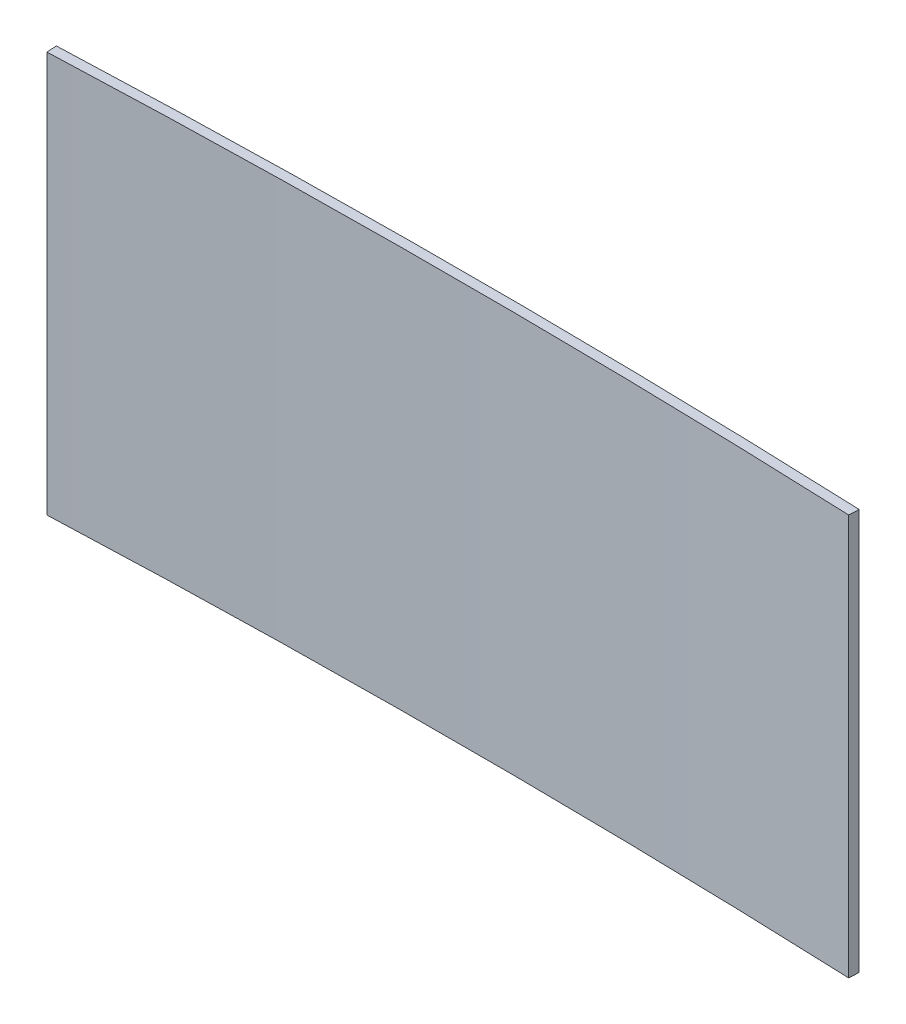
ISO-10303-21;
HEADER;
FILE_DESCRIPTION(('STEP AP214'),'2;1');
FILE_NAME('part.step','',(''),(''),'','','');
FILE_SCHEMA(('AUTOMOTIVE_DESIGN { 1 0 10303 214 1 1 1 1 }'));
ENDSEC;
DATA;
#1=APPLICATION_CONTEXT('core data for automotive mechanical design processes');
#2=APPLICATION_PROTOCOL_DEFINITION('international standard','automotive_design',2000,#1);
#3=PRODUCT_CONTEXT('',#1,'mechanical');
#4=PRODUCT('Part','Part','',(#3));
#5=PRODUCT_RELATED_PRODUCT_CATEGORY('part','',(#4));
#6=PRODUCT_DEFINITION_FORMATION('','',#4);
#7=PRODUCT_DEFINITION_CONTEXT('part definition',#1,'design');
#8=PRODUCT_DEFINITION('design','',#6,#7);
#9=PRODUCT_DEFINITION_SHAPE('','',#8);
#10=(LENGTH_UNIT() NAMED_UNIT(*) SI_UNIT(.MILLI.,.METRE.));
#11=(NAMED_UNIT(*) PLANE_ANGLE_UNIT() SI_UNIT($,.RADIAN.));
#12=(NAMED_UNIT(*) SI_UNIT($,.STERADIAN.) SOLID_ANGLE_UNIT());
#13=UNCERTAINTY_MEASURE_WITH_UNIT(LENGTH_MEASURE(1.E-05),#10,'distance_accuracy_value','');
#14=(GEOMETRIC_REPRESENTATION_CONTEXT(3) GLOBAL_UNCERTAINTY_ASSIGNED_CONTEXT((#13)) GLOBAL_UNIT_ASSIGNED_CONTEXT((#10,
#11,#12)) REPRESENTATION_CONTEXT('',''));
#15=CARTESIAN_POINT('',(0.,0.,0.));
#16=DIRECTION('',(0.,0.,1.));
#17=DIRECTION('',(1.,0.,0.));
#18=AXIS2_PLACEMENT_3D('',#15,#16,#17);
#19=CARTESIAN_POINT('',(0.,20.,0.));
#20=DIRECTION('',(0.,-1.,0.));
#21=DIRECTION('',(0.,0.,-1.));
#22=AXIS2_PLACEMENT_3D('',#19,#20,#21);
#23=CYLINDRICAL_SURFACE('',#22,978.5);
#24=CARTESIAN_POINT('',(0.,-20.,0.));
#25=DIRECTION('',(0.,1.,0.));
#26=DIRECTION('',(1.,0.,0.));
#27=AXIS2_PLACEMENT_3D('',#24,#25,#26);
#28=CIRCLE('',#27,978.5);
#29=CARTESIAN_POINT('',(40.0409207161121,-20.,-977.680405177585));
#30=VERTEX_POINT('',#29);
#31=CARTESIAN_POINT('',(-40.0409207161125,-20.,-977.680405177585));
#32=VERTEX_POINT('',#31);
#33=EDGE_CURVE('E101',#30,#32,#28,.T.);
#34=ORIENTED_EDGE('',*,*,#33,.T.);
#35=DIRECTION('',(0.,-1.,0.));
#36=VECTOR('',#35,1.);
#37=CARTESIAN_POINT('',(-40.0409207161125,20.,-977.680405177585));
#38=LINE('',#37,#36);
#39=CARTESIAN_POINT('',(-40.0409207161125,20.,-977.680405177585));
#40=VERTEX_POINT('',#39);
#41=EDGE_CURVE('E11',#40,#32,#38,.T.);
#42=ORIENTED_EDGE('',*,*,#41,.F.);
#43=CARTESIAN_POINT('',(0.,20.,0.));
#44=DIRECTION('',(0.,1.,0.));
#45=DIRECTION('',(1.,0.,0.));
#46=AXIS2_PLACEMENT_3D('',#43,#44,#45);
#47=CIRCLE('',#46,978.5);
#48=CARTESIAN_POINT('',(40.0409207161121,20.,-977.680405177585));
#49=VERTEX_POINT('',#48);
#50=EDGE_CURVE('E78',#49,#40,#47,.T.);
#51=ORIENTED_EDGE('',*,*,#50,.F.);
#52=DIRECTION('',(0.,-1.,0.));
#53=VECTOR('',#52,1.);
#54=CARTESIAN_POINT('',(40.0409207161121,20.,-977.680405177585));
#55=LINE('',#54,#53);
#56=EDGE_CURVE('E54',#49,#30,#55,.T.);
#57=ORIENTED_EDGE('',*,*,#56,.T.);
#58=EDGE_LOOP('',(#34,#42,#51,#57));
#59=FACE_BOUND('',#58,.T.);
#60=ADVANCED_FACE('F38',(#59),#23,.T.);
#61=CARTESIAN_POINT('',(-39.9999999999999,20.,-976.681242780878));
#62=DIRECTION('',(-0.999162396706778,0.,0.0409207161125905));
#63=DIRECTION('',(0.0409207161125905,0.,0.999162396706778));
#64=AXIS2_PLACEMENT_3D('',#61,#62,#63);
#65=PLANE('',#64);
#66=DIRECTION('',(-0.0409207161125905,0.,-0.999162396706778));
#67=VECTOR('',#66,1.);
#68=CARTESIAN_POINT('',(-39.9999999999999,-20.,-976.681242780878));
#69=LINE('',#68,#67);
#70=CARTESIAN_POINT('',(-39.9999999999999,-20.,-976.681242780878));
#71=VERTEX_POINT('',#70);
#72=EDGE_CURVE('E87',#71,#32,#69,.T.);
#73=ORIENTED_EDGE('',*,*,#72,.F.);
#74=DIRECTION('',(0.,-1.,0.));
#75=VECTOR('',#74,1.);
#76=CARTESIAN_POINT('',(-39.9999999999999,20.,-976.681242780878));
#77=LINE('',#76,#75);
#78=CARTESIAN_POINT('',(-39.9999999999999,20.,-976.681242780878));
#79=VERTEX_POINT('',#78);
#80=EDGE_CURVE('E46',#79,#71,#77,.T.);
#81=ORIENTED_EDGE('',*,*,#80,.F.);
#82=DIRECTION('',(-0.0409207161125905,0.,-0.999162396706778));
#83=VECTOR('',#82,1.);
#84=CARTESIAN_POINT('',(-39.9999999999999,20.,-976.681242780878));
#85=LINE('',#84,#83);
#86=EDGE_CURVE('E85',#79,#40,#85,.T.);
#87=ORIENTED_EDGE('',*,*,#86,.T.);
#88=ORIENTED_EDGE('',*,*,#41,.T.);
#89=EDGE_LOOP('',(#73,#81,#87,#88));
#90=FACE_BOUND('',#89,.T.);
#91=ADVANCED_FACE('F84',(#90),#65,.T.);
#92=CARTESIAN_POINT('',(0.,20.,0.));
#93=DIRECTION('',(0.,-1.,0.));
#94=DIRECTION('',(0.,0.,-1.));
#95=AXIS2_PLACEMENT_3D('',#92,#93,#94);
#96=CYLINDRICAL_SURFACE('',#95,977.5);
#97=CARTESIAN_POINT('',(0.,-20.,0.));
#98=DIRECTION('',(0.,1.,0.));
#99=DIRECTION('',(0.,0.,1.));
#100=AXIS2_PLACEMENT_3D('',#97,#98,#99);
#101=CIRCLE('',#100,977.5);
#102=CARTESIAN_POINT('',(39.9999999999997,-20.,-976.681242780878));
#103=VERTEX_POINT('',#102);
#104=EDGE_CURVE('E104',#103,#71,#101,.T.);
#105=ORIENTED_EDGE('',*,*,#104,.F.);
#106=DIRECTION('',(0.,-1.,0.));
#107=VECTOR('',#106,1.);
#108=CARTESIAN_POINT('',(39.9999999999997,20.,-976.681242780878));
#109=LINE('',#108,#107);
#110=CARTESIAN_POINT('',(39.9999999999997,20.,-976.681242780878));
#111=VERTEX_POINT('',#110);
#112=EDGE_CURVE('E67',#111,#103,#109,.T.);
#113=ORIENTED_EDGE('',*,*,#112,.F.);
#114=CARTESIAN_POINT('',(0.,20.,0.));
#115=DIRECTION('',(0.,1.,0.));
#116=DIRECTION('',(0.,0.,1.));
#117=AXIS2_PLACEMENT_3D('',#114,#115,#116);
#118=CIRCLE('',#117,977.5);
#119=EDGE_CURVE('E93',#111,#79,#118,.T.);
#120=ORIENTED_EDGE('',*,*,#119,.T.);
#121=ORIENTED_EDGE('',*,*,#80,.T.);
#122=EDGE_LOOP('',(#105,#113,#120,#121));
#123=FACE_BOUND('',#122,.T.);
#124=ADVANCED_FACE('F95',(#123),#96,.F.);
#125=CARTESIAN_POINT('',(40.0409207161121,20.,-977.680405177585));
#126=DIRECTION('',(0.999162396706783,0.,0.0409207161124658));
#127=DIRECTION('',(0.0409207161124658,0.,-0.999162396706783));
#128=AXIS2_PLACEMENT_3D('',#125,#126,#127);
#129=PLANE('',#128);
#130=DIRECTION('',(-0.0409207161124658,0.,0.999162396706783));
#131=VECTOR('',#130,1.);
#132=CARTESIAN_POINT('',(40.0409207161121,-20.,-977.680405177585));
#133=LINE('',#132,#131);
#134=EDGE_CURVE('E106',#30,#103,#133,.T.);
#135=ORIENTED_EDGE('',*,*,#134,.F.);
#136=ORIENTED_EDGE('',*,*,#56,.F.);
#137=DIRECTION('',(-0.0409207161124658,0.,0.999162396706783));
#138=VECTOR('',#137,1.);
#139=CARTESIAN_POINT('',(40.0409207161121,20.,-977.680405177585));
#140=LINE('',#139,#138);
#141=EDGE_CURVE('E96',#49,#111,#140,.T.);
#142=ORIENTED_EDGE('',*,*,#141,.T.);
#143=ORIENTED_EDGE('',*,*,#112,.T.);
#144=EDGE_LOOP('',(#135,#136,#142,#143));
#145=FACE_BOUND('',#144,.T.);
#146=ADVANCED_FACE('F112',(#145),#129,.T.);
#147=CARTESIAN_POINT('',(0.,20.,0.));
#148=DIRECTION('',(0.,1.,0.));
#149=DIRECTION('',(1.,0.,0.));
#150=AXIS2_PLACEMENT_3D('',#147,#148,#149);
#151=PLANE('',#150);
#152=ORIENTED_EDGE('',*,*,#50,.T.);
#153=ORIENTED_EDGE('',*,*,#86,.F.);
#154=ORIENTED_EDGE('',*,*,#119,.F.);
#155=ORIENTED_EDGE('',*,*,#141,.F.);
#156=EDGE_LOOP('',(#152,#153,#154,#155));
#157=FACE_BOUND('',#156,.T.);
#158=ADVANCED_FACE('F92',(#157),#151,.T.);
#159=CARTESIAN_POINT('',(0.,-20.,0.));
#160=DIRECTION('',(0.,1.,0.));
#161=DIRECTION('',(1.,0.,0.));
#162=AXIS2_PLACEMENT_3D('',#159,#160,#161);
#163=PLANE('',#162);
#164=ORIENTED_EDGE('',*,*,#33,.F.);
#165=ORIENTED_EDGE('',*,*,#134,.T.);
#166=ORIENTED_EDGE('',*,*,#104,.T.);
#167=ORIENTED_EDGE('',*,*,#72,.T.);
#168=EDGE_LOOP('',(#164,#165,#166,#167));
#169=FACE_BOUND('',#168,.T.);
#170=ADVANCED_FACE('F111',(#169),#163,.F.);
#171=CLOSED_SHELL('',(#60,#91,#124,#146,#158,#170));
#172=MANIFOLD_SOLID_BREP('B2',#171);
#173=ADVANCED_BREP_SHAPE_REPRESENTATION('',(#18,#172),#14);
#174=SHAPE_DEFINITION_REPRESENTATION(#9,#173);
ENDSEC;
END-ISO-10303-21;
